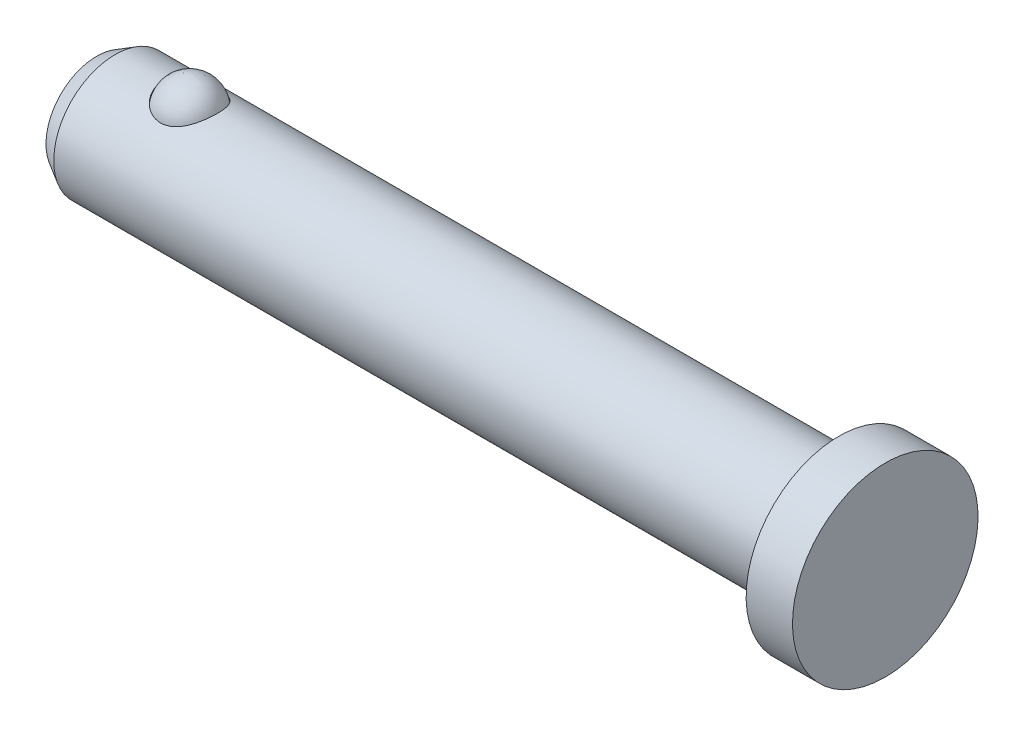
ISO-10303-21;
HEADER;
FILE_DESCRIPTION(('STEP AP214'),'2;1');
FILE_NAME('part.step','',(''),(''),'','','');
FILE_SCHEMA(('AUTOMOTIVE_DESIGN { 1 0 10303 214 1 1 1 1 }'));
ENDSEC;
DATA;
#1=APPLICATION_CONTEXT('core data for automotive mechanical design processes');
#2=APPLICATION_PROTOCOL_DEFINITION('international standard','automotive_design',2000,#1);
#3=PRODUCT_CONTEXT('',#1,'mechanical');
#4=PRODUCT('Part','Part','',(#3));
#5=PRODUCT_RELATED_PRODUCT_CATEGORY('part','',(#4));
#6=PRODUCT_DEFINITION_FORMATION('','',#4);
#7=PRODUCT_DEFINITION_CONTEXT('part definition',#1,'design');
#8=PRODUCT_DEFINITION('design','',#6,#7);
#9=PRODUCT_DEFINITION_SHAPE('','',#8);
#10=(LENGTH_UNIT() NAMED_UNIT(*) SI_UNIT(.MILLI.,.METRE.));
#11=(NAMED_UNIT(*) PLANE_ANGLE_UNIT() SI_UNIT($,.RADIAN.));
#12=(NAMED_UNIT(*) SI_UNIT($,.STERADIAN.) SOLID_ANGLE_UNIT());
#13=UNCERTAINTY_MEASURE_WITH_UNIT(LENGTH_MEASURE(1.E-05),#10,'distance_accuracy_value','');
#14=(GEOMETRIC_REPRESENTATION_CONTEXT(3) GLOBAL_UNCERTAINTY_ASSIGNED_CONTEXT((#13)) GLOBAL_UNIT_ASSIGNED_CONTEXT((#10,
#11,#12)) REPRESENTATION_CONTEXT('',''));
#15=CARTESIAN_POINT('',(0.,0.,0.));
#16=DIRECTION('',(0.,0.,1.));
#17=DIRECTION('',(1.,0.,0.));
#18=AXIS2_PLACEMENT_3D('',#15,#16,#17);
#19=CARTESIAN_POINT('',(-15.465425,2.6365662006244,0.));
#20=DIRECTION('',(-1.,0.,0.));
#21=DIRECTION('',(0.,1.,0.));
#22=AXIS2_PLACEMENT_3D('',#19,#20,#21);
#23=SPHERICAL_SURFACE('',#22,1.47823379937559);
#24=CARTESIAN_POINT('',(-16.9436587993756,2.6365662006244,0.));
#25=VERTEX_POINT('',#24);
#26=VERTEX_LOOP('',#25);
#27=FACE_BOUND('',#26,.T.);
#28=ADVANCED_FACE('F39',(#27),#23,.T.);
#29=CLOSED_SHELL('',(#28));
#30=MANIFOLD_SOLID_BREP('B2',#29);
#31=CARTESIAN_POINT('',(-20.240625,0.,0.));
#32=DIRECTION('',(-1.,0.,0.));
#33=DIRECTION('',(0.,-1.,0.));
#34=AXIS2_PLACEMENT_3D('',#31,#32,#33);
#35=CYLINDRICAL_SURFACE('',#34,3.1496);
#36=CARTESIAN_POINT('',(-19.295745,0.,0.));
#37=DIRECTION('',(-1.,0.,0.));
#38=DIRECTION('',(0.,-1.,0.));
#39=AXIS2_PLACEMENT_3D('',#36,#37,#38);
#40=CIRCLE('',#39,3.1496);
#41=CARTESIAN_POINT('',(-19.295745,-3.1496,0.));
#42=VERTEX_POINT('',#41);
#43=EDGE_CURVE('E63',#42,#42,#40,.T.);
#44=ORIENTED_EDGE('',*,*,#43,.F.);
#45=EDGE_LOOP('',(#44));
#46=FACE_BOUND('',#45,.T.);
#47=CARTESIAN_POINT('',(17.859375,0.,0.));
#48=DIRECTION('',(-1.,0.,0.));
#49=DIRECTION('',(0.,-1.,0.));
#50=AXIS2_PLACEMENT_3D('',#47,#48,#49);
#51=CIRCLE('',#50,3.1496);
#52=CARTESIAN_POINT('',(17.859375,-3.1496,0.));
#53=VERTEX_POINT('',#52);
#54=EDGE_CURVE('E38',#53,#53,#51,.T.);
#55=ORIENTED_EDGE('',*,*,#54,.T.);
#56=EDGE_LOOP('',(#55));
#57=FACE_BOUND('',#56,.T.);
#58=CARTESIAN_POINT('',(-15.465425,2.77075289901505,-1.49763431204225));
#59=CARTESIAN_POINT('',(-15.5389457451515,2.7707577976422,-1.49763066415317));
#60=CARTESIAN_POINT('',(-15.6125527709387,2.77386582390812,-1.49191889380325));
#61=CARTESIAN_POINT('',(-15.7575964129896,2.78593874545231,-1.46924536343803));
#62=CARTESIAN_POINT('',(-15.829028728798,2.79491454489914,-1.45226265758374));
#63=CARTESIAN_POINT('',(-15.9674073811903,2.81763434703292,-1.40767014243824));
#64=CARTESIAN_POINT('',(-16.0343678336591,2.83136240856874,-1.38009582852966));
#65=CARTESIAN_POINT('',(-16.1624690286708,2.86211404144046,-1.31513079550987));
#66=CARTESIAN_POINT('',(-16.2236105762648,2.87913715591109,-1.27774143701736));
#67=CARTESIAN_POINT('',(-16.341443306284,2.91559722418612,-1.19227424661656));
#68=CARTESIAN_POINT('',(-16.397825847076,2.93510690639033,-1.14380270689784));
#69=CARTESIAN_POINT('',(-16.502073067043,2.97403176426434,-1.03839820329996));
#70=CARTESIAN_POINT('',(-16.5499348611918,2.99344690576777,-0.981462385442704));
#71=CARTESIAN_POINT('',(-16.6397161098162,3.03184823056437,-0.855861961693489));
#72=CARTESIAN_POINT('',(-16.6809139413248,3.05069131753024,-0.786636344535894));
#73=CARTESIAN_POINT('',(-16.752021185743,3.08443033310627,-0.641720393914515));
#74=CARTESIAN_POINT('',(-16.7819286908934,3.09932559451429,-0.566028970551984));
#75=CARTESIAN_POINT('',(-16.830614292008,3.12407818904298,-0.40822438330236));
#76=CARTESIAN_POINT('',(-16.8490952025015,3.13380014621954,-0.325997929172322));
#77=CARTESIAN_POINT('',(-16.8734356576058,3.14668596102084,-0.159197801233618));
#78=CARTESIAN_POINT('',(-16.8792956267126,3.14985003921484,-0.0746242064662033));
#79=CARTESIAN_POINT('',(-16.8783079733205,3.14932077650461,0.0938087181207952));
#80=CARTESIAN_POINT('',(-16.8715526610361,3.14567724901869,0.177668761030784));
#81=CARTESIAN_POINT('',(-16.8456211248836,3.13197545840453,0.342905080995655));
#82=CARTESIAN_POINT('',(-16.8264448033618,3.12191714484334,0.424281338517783));
#83=CARTESIAN_POINT('',(-16.7759710968579,3.09634620593555,0.582258049507004));
#84=CARTESIAN_POINT('',(-16.7446758391569,3.08083453788019,0.658859338403599));
#85=CARTESIAN_POINT('',(-16.6704364701138,3.04586036063583,0.805220666886643));
#86=CARTESIAN_POINT('',(-16.6274909162924,3.02639736228874,0.874979857862781));
#87=CARTESIAN_POINT('',(-16.5302414670371,2.98532278779903,1.00628084539425));
#88=CARTESIAN_POINT('',(-16.4758504239978,2.96369543586756,1.06775328626149));
#89=CARTESIAN_POINT('',(-16.3568800465679,2.92078954853933,1.18008058411893));
#90=CARTESIAN_POINT('',(-16.2923010713413,2.89951100087506,1.2309358152601));
#91=CARTESIAN_POINT('',(-16.1561539052774,2.86037744187191,1.31928121702279));
#92=CARTESIAN_POINT('',(-16.0848117954028,2.84244764496686,1.35708523197046));
#93=CARTESIAN_POINT('',(-15.935670254244,2.81163810398318,1.41982581546277));
#94=CARTESIAN_POINT('',(-15.8578753525752,2.79875485317048,1.44477132292341));
#95=CARTESIAN_POINT('',(-15.7047711316856,2.78059619409983,1.47939776784043));
#96=CARTESIAN_POINT('',(-15.6297656074058,2.7747919768752,1.49014557427303));
#97=CARTESIAN_POINT('',(-15.478790940395,2.76970820920505,1.49957654039467));
#98=CARTESIAN_POINT('',(-15.4028221963269,2.77042604208585,1.49826453852657));
#99=CARTESIAN_POINT('',(-15.257158377103,2.7780347655248,1.48410106460022));
#100=CARTESIAN_POINT('',(-15.1873694995176,2.7845340587164,1.47198149806906));
#101=CARTESIAN_POINT('',(-15.051007283836,2.80243988981084,1.43759626131755));
#102=CARTESIAN_POINT('',(-14.984434198762,2.81384681315419,1.41532979416133));
#103=CARTESIAN_POINT('',(-14.854601781902,2.84069003344138,1.36066262287727));
#104=CARTESIAN_POINT('',(-14.7914545159932,2.85621331883956,1.32803970787574));
#105=CARTESIAN_POINT('',(-14.671458743102,2.88961489219802,1.253699785174));
#106=CARTESIAN_POINT('',(-14.6146122208676,2.90749391836186,1.2119799241265));
#107=CARTESIAN_POINT('',(-14.5038865893564,2.94545844109221,1.11672871623674));
#108=CARTESIAN_POINT('',(-14.4506132486742,2.96560578024636,1.06251752632309));
#109=CARTESIAN_POINT('',(-14.3533869775006,3.00481869573106,0.945952592238561));
#110=CARTESIAN_POINT('',(-14.3094371179819,3.0238839141223,0.883596176082403));
#111=CARTESIAN_POINT('',(-14.2289963325796,3.06034011489961,0.74801542094785));
#112=CARTESIAN_POINT('',(-14.1931605367071,3.07754656568952,0.674351447554244));
#113=CARTESIAN_POINT('',(-14.1333033693815,3.10710892114242,0.521456709791352));
#114=CARTESIAN_POINT('',(-14.1092829913369,3.11946441793262,0.442225477981753));
#115=CARTESIAN_POINT('',(-14.073193131104,3.13827210256697,0.279338957613095));
#116=CARTESIAN_POINT('',(-14.0612781836068,3.14464787790253,0.195640477648151));
#117=CARTESIAN_POINT('',(-14.0501260782276,3.15061049692739,0.0271657928173689));
#118=CARTESIAN_POINT('',(-14.0508884994512,3.15019756600476,-0.0576103761753363));
#119=CARTESIAN_POINT('',(-14.0650171880794,3.14265589936076,-0.225084459171221));
#120=CARTESIAN_POINT('',(-14.0782782771415,3.13558320709379,-0.307793809649826));
#121=CARTESIAN_POINT('',(-14.1170482516657,3.11547130810925,-0.469533719846554));
#122=CARTESIAN_POINT('',(-14.1425575999411,3.10243187593313,-0.548564140428731));
#123=CARTESIAN_POINT('',(-14.2055620096069,3.07157238476346,-0.701072665417481));
#124=CARTESIAN_POINT('',(-14.2431045339086,3.05373344038888,-0.774527333754976));
#125=CARTESIAN_POINT('',(-14.3295694805041,3.01506747882648,-0.913541398657458));
#126=CARTESIAN_POINT('',(-14.3784928375168,2.99424021625908,-0.979100146051263));
#127=CARTESIAN_POINT('',(-14.4871205801353,2.95169333067687,-1.10075441535664));
#128=CARTESIAN_POINT('',(-14.5468659705632,2.9299705651034,-1.15681231837799));
#129=CARTESIAN_POINT('',(-14.675879388042,2.88818497729841,-1.25751713910878));
#130=CARTESIAN_POINT('',(-14.745149116142,2.86812245261391,-1.30216201436713));
#131=CARTESIAN_POINT('',(-14.8884750268298,2.83294559735111,-1.376969566074));
#132=CARTESIAN_POINT('',(-14.9622180792203,2.81766197614307,-1.40765142260028));
#133=CARTESIAN_POINT('',(-15.1146729643659,2.7929911166257,-1.45599877020551));
#134=CARTESIAN_POINT('',(-15.1933710534896,2.78358829676476,-1.47369867946937));
#135=CARTESIAN_POINT('',(-15.3049505417416,2.77544217796298,-1.48893169162427));
#136=CARTESIAN_POINT('',(-15.3369272792104,2.7736890088413,-1.49219148554809));
#137=CARTESIAN_POINT('',(-15.4010721632532,2.77134328335813,-1.4965436199652));
#138=CARTESIAN_POINT('',(-15.4332403143573,2.77075075457575,-1.49763590895429));
#139=CARTESIAN_POINT('',(-15.465425,2.77075289901505,-1.49763431204225));
#140=B_SPLINE_CURVE_WITH_KNOTS('',3,(#58,#59,#60,#61,#62,#63,#64,#65,#66,#67,#68,#69,#70,#71,
#72,#73,#74,#75,#76,#77,#78,#79,#80,#81,#82,#83,#84,#85,#86,#87,#88,#89,#90,#91,#92,#93,#94,#95,
#96,#97,#98,#99,#100,#101,#102,#103,#104,#105,#106,#107,#108,#109,#110,#111,#112,#113,#114,#115,
#116,#117,#118,#119,#120,#121,#122,#123,#124,#125,#126,#127,#128,#129,#130,#131,#132,#133,#134,
#135,#136,#137,#138,#139),.UNSPECIFIED.,.T.,.F.,(4,2,2,2,2,2,2,2,2,2,2,2,2,2,2,2,2,2,2,2,2,2,2,
2,2,2,2,2,2,2,2,2,2,2,2,2,2,2,2,2,4),(0.,0.22043210917456,0.44127501946109,0.6613841923537,
0.881462868527985,1.11110044614915,1.34081562912911,1.58787696191067,1.83498002269837,
2.08826571054054,2.34154287917335,2.59297399246219,2.844407082523,3.09579605760673,
3.34721617258743,3.60062478865463,3.85402447308242,4.10081848429875,4.34744069826165,
4.57421587030098,4.80090006321539,5.01330873796401,5.22573409813022,5.44306628836483,
5.66046674530617,5.89534123539879,6.13029296885871,6.3802410014827,6.63021004547546,
6.88333148505368,7.13644452090418,7.38744640876753,7.638457781742,7.89047167068376,
8.14250626508079,8.39551659585659,8.64857217317521,8.89124176055608,9.13326562507915,
9.22976042461492,9.32625751703032),.UNSPECIFIED.);
#141=CARTESIAN_POINT('',(-15.465425,2.77075289901505,-1.49763431204225));
#142=VERTEX_POINT('',#141);
#143=EDGE_CURVE('E55',#142,#142,#140,.T.);
#144=ORIENTED_EDGE('',*,*,#143,.F.);
#145=EDGE_LOOP('',(#144));
#146=FACE_BOUND('',#145,.T.);
#147=ADVANCED_FACE('F51',(#46,#57,#146),#35,.T.);
#148=CARTESIAN_POINT('',(17.859375,3.1496,0.));
#149=DIRECTION('',(1.,0.,0.));
#150=DIRECTION('',(0.,1.,0.));
#151=AXIS2_PLACEMENT_3D('',#148,#149,#150);
#152=PLANE('',#151);
#153=ORIENTED_EDGE('',*,*,#54,.F.);
#154=EDGE_LOOP('',(#153));
#155=FACE_BOUND('',#154,.T.);
#156=CARTESIAN_POINT('',(17.859375,0.,0.));
#157=DIRECTION('',(-1.,0.,0.));
#158=DIRECTION('',(0.,-1.,0.));
#159=AXIS2_PLACEMENT_3D('',#156,#157,#158);
#160=CIRCLE('',#159,4.76250000000001);
#161=CARTESIAN_POINT('',(17.859375,-4.76250000000001,0.));
#162=VERTEX_POINT('',#161);
#163=EDGE_CURVE('E75',#162,#162,#160,.T.);
#164=ORIENTED_EDGE('',*,*,#163,.T.);
#165=EDGE_LOOP('',(#164));
#166=FACE_BOUND('',#165,.T.);
#167=ADVANCED_FACE('F53',(#155,#166),#152,.F.);
#168=CARTESIAN_POINT('',(-19.295745,0.,0.));
#169=DIRECTION('',(1.,0.,0.));
#170=DIRECTION('',(0.,1.,0.));
#171=AXIS2_PLACEMENT_3D('',#168,#169,#170);
#172=CONICAL_SURFACE('',#171,3.1496,0.5235987755983);
#173=CARTESIAN_POINT('',(-20.240625,0.,0.));
#174=DIRECTION('',(-1.,0.,0.));
#175=DIRECTION('',(0.,-1.,0.));
#176=AXIS2_PLACEMENT_3D('',#173,#174,#175);
#177=CIRCLE('',#176,2.6040732776481);
#178=CARTESIAN_POINT('',(-20.240625,-2.6040732776481,0.));
#179=VERTEX_POINT('',#178);
#180=EDGE_CURVE('E67',#179,#179,#177,.T.);
#181=ORIENTED_EDGE('',*,*,#180,.F.);
#182=EDGE_LOOP('',(#181));
#183=FACE_BOUND('',#182,.T.);
#184=ORIENTED_EDGE('',*,*,#43,.T.);
#185=EDGE_LOOP('',(#184));
#186=FACE_BOUND('',#185,.T.);
#187=ADVANCED_FACE('F89',(#183,#186),#172,.T.);
#188=CARTESIAN_POINT('',(-20.240625,2.6040732776481,0.));
#189=DIRECTION('',(1.,0.,0.));
#190=DIRECTION('',(0.,1.,0.));
#191=AXIS2_PLACEMENT_3D('',#188,#189,#190);
#192=PLANE('',#191);
#193=ORIENTED_EDGE('',*,*,#180,.T.);
#194=EDGE_LOOP('',(#193));
#195=FACE_BOUND('',#194,.T.);
#196=ADVANCED_FACE('F96',(#195),#192,.F.);
#197=CARTESIAN_POINT('',(20.240625,4.76250000000001,0.));
#198=DIRECTION('',(-1.,0.,0.));
#199=DIRECTION('',(0.,-1.,0.));
#200=AXIS2_PLACEMENT_3D('',#197,#198,#199);
#201=PLANE('',#200);
#202=CARTESIAN_POINT('',(20.240625,0.,0.));
#203=DIRECTION('',(-1.,0.,0.));
#204=DIRECTION('',(0.,-1.,0.));
#205=AXIS2_PLACEMENT_3D('',#202,#203,#204);
#206=CIRCLE('',#205,4.76250000000001);
#207=CARTESIAN_POINT('',(20.240625,-4.76250000000001,0.));
#208=VERTEX_POINT('',#207);
#209=EDGE_CURVE('E72',#208,#208,#206,.T.);
#210=ORIENTED_EDGE('',*,*,#209,.F.);
#211=EDGE_LOOP('',(#210));
#212=FACE_BOUND('',#211,.T.);
#213=ADVANCED_FACE('F100',(#212),#201,.F.);
#214=CARTESIAN_POINT('',(-20.240625,0.,0.));
#215=DIRECTION('',(-1.,0.,0.));
#216=DIRECTION('',(0.,-1.,0.));
#217=AXIS2_PLACEMENT_3D('',#214,#215,#216);
#218=CYLINDRICAL_SURFACE('',#217,4.76250000000001);
#219=ORIENTED_EDGE('',*,*,#163,.F.);
#220=EDGE_LOOP('',(#219));
#221=FACE_BOUND('',#220,.T.);
#222=ORIENTED_EDGE('',*,*,#209,.T.);
#223=EDGE_LOOP('',(#222));
#224=FACE_BOUND('',#223,.T.);
#225=ADVANCED_FACE('F104',(#221,#224),#218,.T.);
#226=CARTESIAN_POINT('',(-15.465425,2.6365662006244,0.));
#227=DIRECTION('',(-1.,0.,0.));
#228=DIRECTION('',(0.,-1.,0.));
#229=AXIS2_PLACEMENT_3D('',#226,#227,#228);
#230=SPHERICAL_SURFACE('',#229,1.50363379937559);
#231=ORIENTED_EDGE('',*,*,#143,.T.);
#232=EDGE_LOOP('',(#231));
#233=FACE_BOUND('',#232,.T.);
#234=ADVANCED_FACE('F82',(#233),#230,.F.);
#235=CLOSED_SHELL('',(#147,#167,#187,#196,#213,#225,#234));
#236=MANIFOLD_SOLID_BREP('B6',#235);
#237=ADVANCED_BREP_SHAPE_REPRESENTATION('',(#18,#30,#236),#14);
#238=SHAPE_DEFINITION_REPRESENTATION(#9,#237);
ENDSEC;
END-ISO-10303-21;
